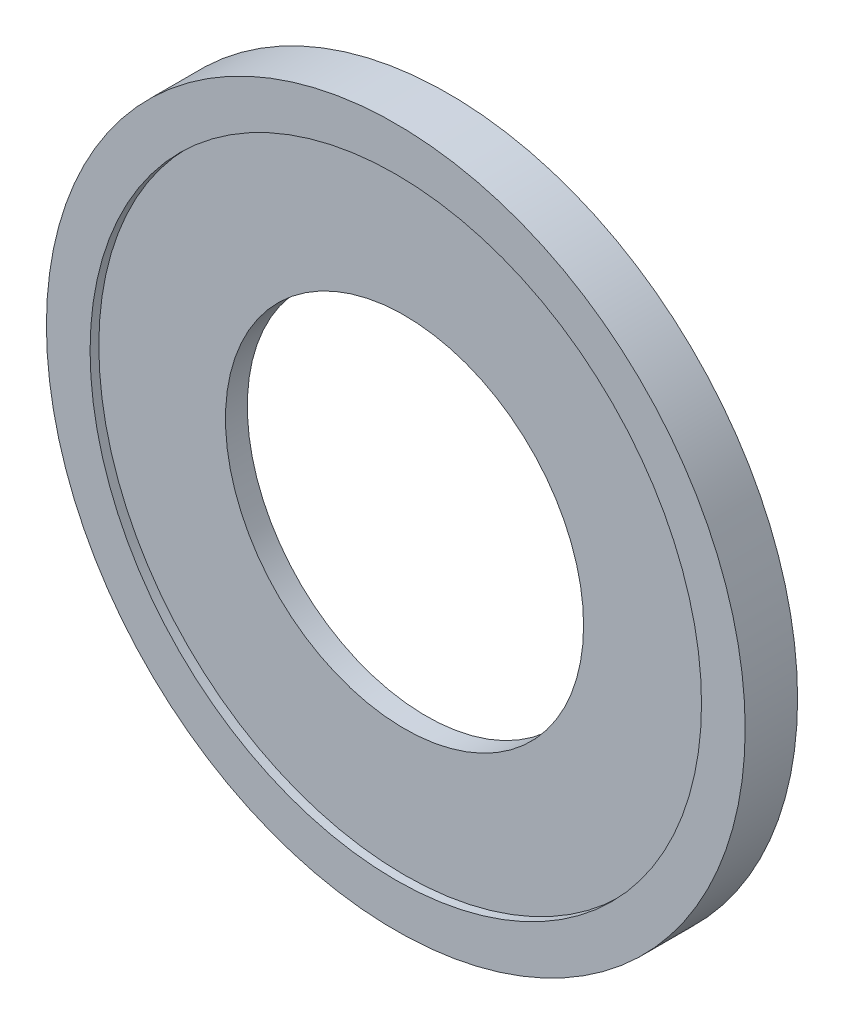
ISO-10303-21;
HEADER;
FILE_DESCRIPTION(('STEP AP214'),'2;1');
FILE_NAME('part.step','',(''),(''),'','','');
FILE_SCHEMA(('AUTOMOTIVE_DESIGN { 1 0 10303 214 1 1 1 1 }'));
ENDSEC;
DATA;
#1=APPLICATION_CONTEXT('core data for automotive mechanical design processes');
#2=APPLICATION_PROTOCOL_DEFINITION('international standard','automotive_design',2000,#1);
#3=PRODUCT_CONTEXT('',#1,'mechanical');
#4=PRODUCT('Part','Part','',(#3));
#5=PRODUCT_RELATED_PRODUCT_CATEGORY('part','',(#4));
#6=PRODUCT_DEFINITION_FORMATION('','',#4);
#7=PRODUCT_DEFINITION_CONTEXT('part definition',#1,'design');
#8=PRODUCT_DEFINITION('design','',#6,#7);
#9=PRODUCT_DEFINITION_SHAPE('','',#8);
#10=(LENGTH_UNIT() NAMED_UNIT(*) SI_UNIT(.MILLI.,.METRE.));
#11=(NAMED_UNIT(*) PLANE_ANGLE_UNIT() SI_UNIT($,.RADIAN.));
#12=(NAMED_UNIT(*) SI_UNIT($,.STERADIAN.) SOLID_ANGLE_UNIT());
#13=UNCERTAINTY_MEASURE_WITH_UNIT(LENGTH_MEASURE(1.E-05),#10,'distance_accuracy_value','');
#14=(GEOMETRIC_REPRESENTATION_CONTEXT(3) GLOBAL_UNCERTAINTY_ASSIGNED_CONTEXT((#13)) GLOBAL_UNIT_ASSIGNED_CONTEXT((#10,
#11,#12)) REPRESENTATION_CONTEXT('',''));
#15=CARTESIAN_POINT('',(0.,0.,0.));
#16=DIRECTION('',(0.,0.,1.));
#17=DIRECTION('',(1.,0.,0.));
#18=AXIS2_PLACEMENT_3D('',#15,#16,#17);
#19=CARTESIAN_POINT('',(0.,0.,3.5));
#20=DIRECTION('',(0.,0.,1.));
#21=DIRECTION('',(1.,0.,0.));
#22=AXIS2_PLACEMENT_3D('',#19,#20,#21);
#23=PLANE('',#22);
#24=CARTESIAN_POINT('',(0.,0.,3.5));
#25=DIRECTION('',(0.,0.,1.));
#26=DIRECTION('',(1.,0.,0.));
#27=AXIS2_PLACEMENT_3D('',#24,#25,#26);
#28=CIRCLE('',#27,4.1);
#29=CARTESIAN_POINT('',(4.1,0.,3.5));
#30=VERTEX_POINT('',#29);
#31=EDGE_CURVE('E44',#30,#30,#28,.T.);
#32=ORIENTED_EDGE('',*,*,#31,.F.);
#33=EDGE_LOOP('',(#32));
#34=FACE_BOUND('',#33,.T.);
#35=CARTESIAN_POINT('',(0.,0.,3.5));
#36=DIRECTION('',(0.,0.,1.));
#37=DIRECTION('',(1.,0.,0.));
#38=AXIS2_PLACEMENT_3D('',#35,#36,#37);
#39=CIRCLE('',#38,7.);
#40=CARTESIAN_POINT('',(7.,0.,3.5));
#41=VERTEX_POINT('',#40);
#42=EDGE_CURVE('E10',#41,#41,#39,.F.);
#43=ORIENTED_EDGE('',*,*,#42,.F.);
#44=EDGE_LOOP('',(#43));
#45=FACE_BOUND('',#44,.T.);
#46=ADVANCED_FACE('F40',(#34,#45),#23,.T.);
#47=CARTESIAN_POINT('',(0.,0.,3.));
#48=DIRECTION('',(0.,0.,1.));
#49=DIRECTION('',(1.,0.,0.));
#50=AXIS2_PLACEMENT_3D('',#47,#48,#49);
#51=PLANE('',#50);
#52=CARTESIAN_POINT('',(0.,0.,3.));
#53=DIRECTION('',(0.,0.,1.));
#54=DIRECTION('',(1.,0.,0.));
#55=AXIS2_PLACEMENT_3D('',#52,#53,#54);
#56=CIRCLE('',#55,4.1);
#57=CARTESIAN_POINT('',(4.1,0.,3.));
#58=VERTEX_POINT('',#57);
#59=EDGE_CURVE('E49',#58,#58,#56,.T.);
#60=ORIENTED_EDGE('',*,*,#59,.T.);
#61=EDGE_LOOP('',(#60));
#62=FACE_BOUND('',#61,.T.);
#63=CARTESIAN_POINT('',(0.,0.,3.));
#64=DIRECTION('',(0.,0.,1.));
#65=DIRECTION('',(1.,0.,0.));
#66=AXIS2_PLACEMENT_3D('',#63,#64,#65);
#67=CIRCLE('',#66,7.);
#68=CARTESIAN_POINT('',(7.,0.,3.));
#69=VERTEX_POINT('',#68);
#70=EDGE_CURVE('E41',#69,#69,#67,.F.);
#71=ORIENTED_EDGE('',*,*,#70,.T.);
#72=EDGE_LOOP('',(#71));
#73=FACE_BOUND('',#72,.T.);
#74=ADVANCED_FACE('F86',(#62,#73),#51,.F.);
#75=CARTESIAN_POINT('',(0.,0.,3.5));
#76=DIRECTION('',(0.,0.,-1.));
#77=DIRECTION('',(-1.,0.,0.));
#78=AXIS2_PLACEMENT_3D('',#75,#76,#77);
#79=CYLINDRICAL_SURFACE('',#78,4.1);
#80=ORIENTED_EDGE('',*,*,#31,.T.);
#81=EDGE_LOOP('',(#80));
#82=FACE_BOUND('',#81,.T.);
#83=ORIENTED_EDGE('',*,*,#59,.F.);
#84=EDGE_LOOP('',(#83));
#85=FACE_BOUND('',#84,.T.);
#86=ADVANCED_FACE('F92',(#82,#85),#79,.F.);
#87=CARTESIAN_POINT('',(0.,0.,2.5));
#88=DIRECTION('',(0.,0.,1.));
#89=DIRECTION('',(1.,0.,0.));
#90=AXIS2_PLACEMENT_3D('',#87,#88,#89);
#91=PLANE('',#90);
#92=CARTESIAN_POINT('',(0.,0.,2.5));
#93=DIRECTION('',(0.,0.,1.));
#94=DIRECTION('',(1.,0.,0.));
#95=AXIS2_PLACEMENT_3D('',#92,#93,#94);
#96=CIRCLE('',#95,8.);
#97=CARTESIAN_POINT('',(8.,0.,2.5));
#98=VERTEX_POINT('',#97);
#99=EDGE_CURVE('E52',#98,#98,#96,.T.);
#100=ORIENTED_EDGE('',*,*,#99,.F.);
#101=EDGE_LOOP('',(#100));
#102=FACE_BOUND('',#101,.T.);
#103=CARTESIAN_POINT('',(0.,0.,2.5));
#104=DIRECTION('',(0.,0.,1.));
#105=DIRECTION('',(1.,0.,0.));
#106=AXIS2_PLACEMENT_3D('',#103,#104,#105);
#107=CIRCLE('',#106,7.);
#108=CARTESIAN_POINT('',(7.,0.,2.5));
#109=VERTEX_POINT('',#108);
#110=EDGE_CURVE('E66',#109,#109,#107,.T.);
#111=ORIENTED_EDGE('',*,*,#110,.T.);
#112=EDGE_LOOP('',(#111));
#113=FACE_BOUND('',#112,.T.);
#114=ADVANCED_FACE('F97',(#102,#113),#91,.F.);
#115=CARTESIAN_POINT('',(0.,0.,3.7));
#116=DIRECTION('',(0.,0.,-1.));
#117=DIRECTION('',(-1.,0.,0.));
#118=AXIS2_PLACEMENT_3D('',#115,#116,#117);
#119=CYLINDRICAL_SURFACE('',#118,7.);
#120=ORIENTED_EDGE('',*,*,#110,.F.);
#121=EDGE_LOOP('',(#120));
#122=FACE_BOUND('',#121,.T.);
#123=ORIENTED_EDGE('',*,*,#70,.F.);
#124=EDGE_LOOP('',(#123));
#125=FACE_BOUND('',#124,.T.);
#126=ADVANCED_FACE('F84',(#122,#125),#119,.F.);
#127=CARTESIAN_POINT('',(0.,0.,3.5));
#128=DIRECTION('',(0.,0.,-1.));
#129=DIRECTION('',(-1.,0.,0.));
#130=AXIS2_PLACEMENT_3D('',#127,#128,#129);
#131=CYLINDRICAL_SURFACE('',#130,8.);
#132=ORIENTED_EDGE('',*,*,#99,.T.);
#133=EDGE_LOOP('',(#132));
#134=FACE_BOUND('',#133,.T.);
#135=CARTESIAN_POINT('',(0.,0.,3.7));
#136=DIRECTION('',(0.,0.,1.));
#137=DIRECTION('',(1.,0.,0.));
#138=AXIS2_PLACEMENT_3D('',#135,#136,#137);
#139=CIRCLE('',#138,8.);
#140=CARTESIAN_POINT('',(8.,0.,3.7));
#141=VERTEX_POINT('',#140);
#142=EDGE_CURVE('E56',#141,#141,#139,.T.);
#143=ORIENTED_EDGE('',*,*,#142,.F.);
#144=EDGE_LOOP('',(#143));
#145=FACE_BOUND('',#144,.T.);
#146=ADVANCED_FACE('F39',(#134,#145),#131,.T.);
#147=CARTESIAN_POINT('',(0.,0.,3.7));
#148=DIRECTION('',(0.,0.,1.));
#149=DIRECTION('',(1.,0.,0.));
#150=AXIS2_PLACEMENT_3D('',#147,#148,#149);
#151=PLANE('',#150);
#152=ORIENTED_EDGE('',*,*,#142,.T.);
#153=EDGE_LOOP('',(#152));
#154=FACE_BOUND('',#153,.T.);
#155=CARTESIAN_POINT('',(0.,0.,3.7));
#156=DIRECTION('',(0.,0.,1.));
#157=DIRECTION('',(1.,0.,0.));
#158=AXIS2_PLACEMENT_3D('',#155,#156,#157);
#159=CIRCLE('',#158,7.);
#160=CARTESIAN_POINT('',(7.,0.,3.7));
#161=VERTEX_POINT('',#160);
#162=EDGE_CURVE('E68',#161,#161,#159,.T.);
#163=ORIENTED_EDGE('',*,*,#162,.F.);
#164=EDGE_LOOP('',(#163));
#165=FACE_BOUND('',#164,.T.);
#166=ADVANCED_FACE('F77',(#154,#165),#151,.T.);
#167=ORIENTED_EDGE('',*,*,#42,.T.);
#168=EDGE_LOOP('',(#167));
#169=FACE_BOUND('',#168,.T.);
#170=ORIENTED_EDGE('',*,*,#162,.T.);
#171=EDGE_LOOP('',(#170));
#172=FACE_BOUND('',#171,.T.);
#173=ADVANCED_FACE('F74',(#169,#172),#119,.F.);
#174=CLOSED_SHELL('',(#46,#74,#86,#114,#126,#146,#166,#173));
#175=MANIFOLD_SOLID_BREP('B2',#174);
#176=ADVANCED_BREP_SHAPE_REPRESENTATION('',(#18,#175),#14);
#177=SHAPE_DEFINITION_REPRESENTATION(#9,#176);
ENDSEC;
END-ISO-10303-21;
